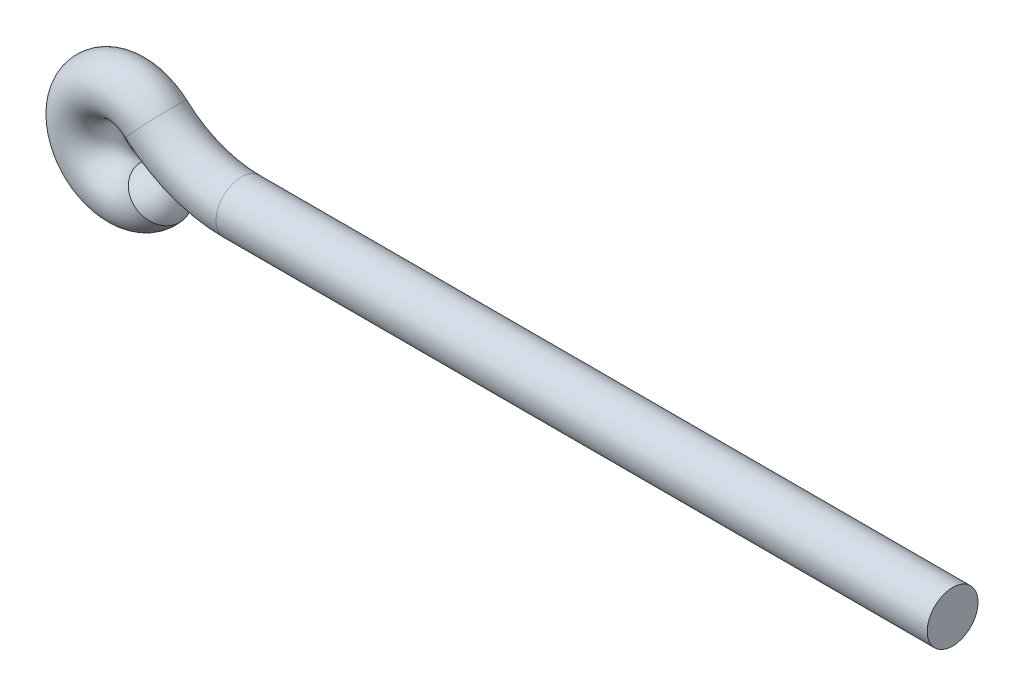
ISO-10303-21;
HEADER;
FILE_DESCRIPTION(('STEP AP214'),'2;1');
FILE_NAME('part.step','',(''),(''),'','','');
FILE_SCHEMA(('AUTOMOTIVE_DESIGN { 1 0 10303 214 1 1 1 1 }'));
ENDSEC;
DATA;
#1=APPLICATION_CONTEXT('core data for automotive mechanical design processes');
#2=APPLICATION_PROTOCOL_DEFINITION('international standard','automotive_design',2000,#1);
#3=PRODUCT_CONTEXT('',#1,'mechanical');
#4=PRODUCT('Part','Part','',(#3));
#5=PRODUCT_RELATED_PRODUCT_CATEGORY('part','',(#4));
#6=PRODUCT_DEFINITION_FORMATION('','',#4);
#7=PRODUCT_DEFINITION_CONTEXT('part definition',#1,'design');
#8=PRODUCT_DEFINITION('design','',#6,#7);
#9=PRODUCT_DEFINITION_SHAPE('','',#8);
#10=(LENGTH_UNIT() NAMED_UNIT(*) SI_UNIT(.MILLI.,.METRE.));
#11=(NAMED_UNIT(*) PLANE_ANGLE_UNIT() SI_UNIT($,.RADIAN.));
#12=(NAMED_UNIT(*) SI_UNIT($,.STERADIAN.) SOLID_ANGLE_UNIT());
#13=UNCERTAINTY_MEASURE_WITH_UNIT(LENGTH_MEASURE(1.E-05),#10,'distance_accuracy_value','');
#14=(GEOMETRIC_REPRESENTATION_CONTEXT(3) GLOBAL_UNCERTAINTY_ASSIGNED_CONTEXT((#13)) GLOBAL_UNIT_ASSIGNED_CONTEXT((#10,
#11,#12)) REPRESENTATION_CONTEXT('',''));
#15=CARTESIAN_POINT('',(0.,0.,0.));
#16=DIRECTION('',(0.,0.,1.));
#17=DIRECTION('',(1.,0.,0.));
#18=AXIS2_PLACEMENT_3D('',#15,#16,#17);
#19=CARTESIAN_POINT('',(-170.375216690108,-22.3365603594771,3.47605885659713E-06));
#20=DIRECTION('',(0.,0.,1.));
#21=DIRECTION('',(1.,0.,0.));
#22=AXIS2_PLACEMENT_3D('',#19,#20,#21);
#23=SPHERICAL_SURFACE('',#22,16.7265803571429);
#24=CARTESIAN_POINT('',(-170.375216690108,-22.3365603594771,3.47605885659713E-06));
#25=DIRECTION('',(0.64278760968654,0.766044443118977,0.));
#26=DIRECTION('',(0.,0.,1.));
#27=AXIS2_PLACEMENT_3D('',#24,#25,#26);
#28=SPHERICAL_SURFACE('',#27,16.7265803571429);
#29=CARTESIAN_POINT('',(-166.695125623625,-17.9507986099228,3.47605885659713E-06));
#30=DIRECTION('',(0.64278760968654,0.766044443118977,0.));
#31=DIRECTION('',(0.,0.,1.));
#32=AXIS2_PLACEMENT_3D('',#29,#30,#31);
#33=CIRCLE('',#32,15.71625);
#34=CARTESIAN_POINT('',(-154.655779644457,-28.0530093806589,3.47605885659713E-06));
#35=VERTEX_POINT('',#34);
#36=EDGE_CURVE('E53',#35,#35,#33,.T.);
#37=ORIENTED_EDGE('',*,*,#36,.T.);
#38=EDGE_LOOP('',(#37));
#39=FACE_BOUND('',#38,.T.);
#40=ADVANCED_FACE('F50',(#39),#28,.T.);
#41=CARTESIAN_POINT('',(-187.76398108717,-0.271929761134694,3.47605885659713E-06));
#42=DIRECTION('',(0.,0.,-1.));
#43=DIRECTION('',(-1.,0.,0.));
#44=AXIS2_PLACEMENT_3D('',#41,#42,#43);
#45=TOROIDAL_SURFACE('',#44,27.5034375,15.71625);
#46=CARTESIAN_POINT('',(-169.287419155646,20.100986905532,3.47605885659713E-06));
#47=DIRECTION('',(-0.74074074074074,0.671791005452483,0.));
#48=DIRECTION('',(0.,0.,1.));
#49=AXIS2_PLACEMENT_3D('',#46,#47,#48);
#50=CIRCLE('',#49,15.71625);
#51=CARTESIAN_POINT('',(-158.729383766203,31.7426535721986,3.47605885659713E-06));
#52=VERTEX_POINT('',#51);
#53=EDGE_CURVE('E57',#52,#52,#50,.T.);
#54=CARTESIAN_POINT('',(-187.76398108717,-0.271929761134694,3.47605885659713E-06));
#55=DIRECTION('',(0.,0.,-1.));
#56=DIRECTION('',(-1.,0.,0.));
#57=AXIS2_PLACEMENT_3D('',#54,#55,#56);
#58=CIRCLE('',#57,43.2196875);
#59=EDGE_CURVE('',#35,#52,#58,.T.);
#60=ORIENTED_EDGE('',*,*,#36,.F.);
#61=ORIENTED_EDGE('',*,*,#53,.T.);
#62=ORIENTED_EDGE('',*,*,#59,.T.);
#63=ORIENTED_EDGE('',*,*,#59,.F.);
#64=EDGE_LOOP('',(#60,#62,#61,#63));
#65=FACE_BOUND('',#64,.T.);
#66=ADVANCED_FACE('F71',(#65),#45,.T.);
#67=CARTESIAN_POINT('',(-116.497242208433,78.3093202388653,3.47605885659713E-06));
#68=DIRECTION('',(0.,0.,1.));
#69=DIRECTION('',(1.,0.,0.));
#70=AXIS2_PLACEMENT_3D('',#67,#68,#69);
#71=TOROIDAL_SURFACE('',#70,78.58125,15.71625);
#72=CARTESIAN_POINT('',(-116.497242208433,-0.271929761134676,3.47605885659713E-06));
#73=DIRECTION('',(-1.,0.,0.));
#74=DIRECTION('',(0.,0.,1.));
#75=AXIS2_PLACEMENT_3D('',#72,#73,#74);
#76=CIRCLE('',#75,15.71625);
#77=CARTESIAN_POINT('',(-116.497242208433,-0.271929761134676,15.7162534760589));
#78=VERTEX_POINT('',#77);
#79=EDGE_CURVE('E11',#78,#78,#76,.T.);
#80=ORIENTED_EDGE('',*,*,#79,.T.);
#81=EDGE_LOOP('',(#80));
#82=FACE_BOUND('',#81,.T.);
#83=ORIENTED_EDGE('',*,*,#53,.F.);
#84=EDGE_LOOP('',(#83));
#85=FACE_BOUND('',#84,.T.);
#86=ADVANCED_FACE('F73',(#82,#85),#71,.T.);
#87=CARTESIAN_POINT('',(-116.497242208433,-0.271929761134694,3.47605885659713E-06));
#88=DIRECTION('',(1.,0.,0.));
#89=DIRECTION('',(0.,0.,-1.));
#90=AXIS2_PLACEMENT_3D('',#87,#88,#89);
#91=CYLINDRICAL_SURFACE('',#90,15.71625);
#92=ORIENTED_EDGE('',*,*,#79,.F.);
#93=EDGE_LOOP('',(#92));
#94=FACE_BOUND('',#93,.T.);
#95=CARTESIAN_POINT('',(323.557757791567,-0.271929761134694,3.47605885659713E-06));
#96=DIRECTION('',(1.,0.,0.));
#97=DIRECTION('',(0.,0.,-1.));
#98=AXIS2_PLACEMENT_3D('',#95,#96,#97);
#99=CIRCLE('',#98,15.71625);
#100=CARTESIAN_POINT('',(323.557757791567,-0.271929761134694,-15.7162465239411));
#101=VERTEX_POINT('',#100);
#102=EDGE_CURVE('E63',#101,#101,#99,.T.);
#103=ORIENTED_EDGE('',*,*,#102,.F.);
#104=EDGE_LOOP('',(#103));
#105=FACE_BOUND('',#104,.T.);
#106=ADVANCED_FACE('F80',(#94,#105),#91,.T.);
#107=CARTESIAN_POINT('',(323.557757791567,-0.271929761134694,3.47605885659713E-06));
#108=DIRECTION('',(1.,0.,0.));
#109=DIRECTION('',(0.,0.,-1.));
#110=AXIS2_PLACEMENT_3D('',#107,#108,#109);
#111=PLANE('',#110);
#112=ORIENTED_EDGE('',*,*,#102,.T.);
#113=EDGE_LOOP('',(#112));
#114=FACE_BOUND('',#113,.T.);
#115=ADVANCED_FACE('F82',(#114),#111,.T.);
#116=CLOSED_SHELL('',(#40,#66,#86,#106,#115));
#117=MANIFOLD_SOLID_BREP('B2',#116);
#118=ADVANCED_BREP_SHAPE_REPRESENTATION('',(#18,#117),#14);
#119=SHAPE_DEFINITION_REPRESENTATION(#9,#118);
ENDSEC;
END-ISO-10303-21;
